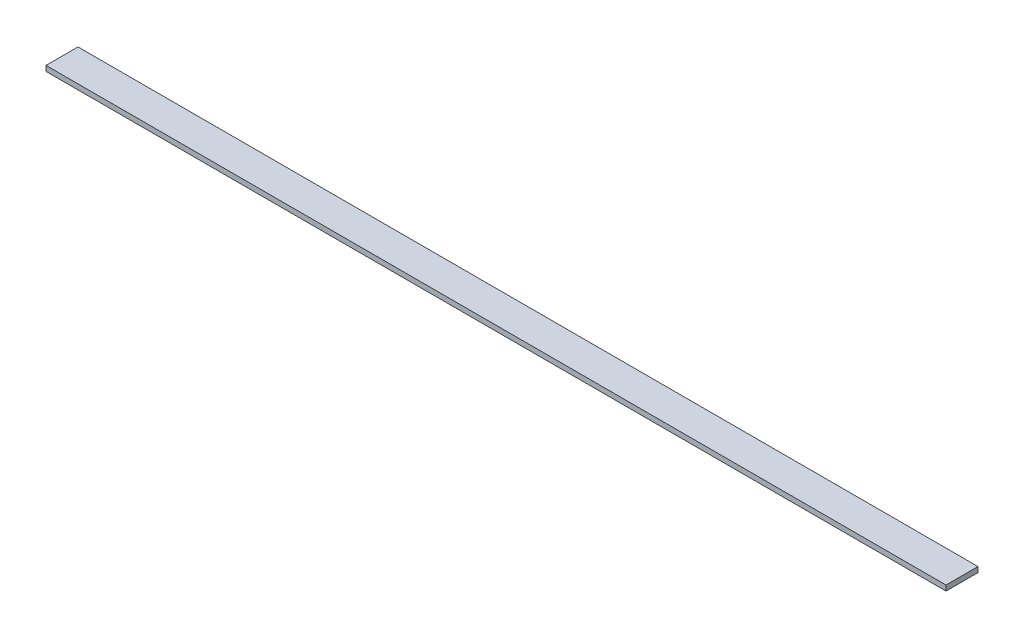
ISO-10303-21;
HEADER;
FILE_DESCRIPTION(('STEP AP214'),'2;1');
FILE_NAME('part.step','',(''),(''),'','','');
FILE_SCHEMA(('AUTOMOTIVE_DESIGN { 1 0 10303 214 1 1 1 1 }'));
ENDSEC;
DATA;
#1=APPLICATION_CONTEXT('core data for automotive mechanical design processes');
#2=APPLICATION_PROTOCOL_DEFINITION('international standard','automotive_design',2000,#1);
#3=PRODUCT_CONTEXT('',#1,'mechanical');
#4=PRODUCT('Part','Part','',(#3));
#5=PRODUCT_RELATED_PRODUCT_CATEGORY('part','',(#4));
#6=PRODUCT_DEFINITION_FORMATION('','',#4);
#7=PRODUCT_DEFINITION_CONTEXT('part definition',#1,'design');
#8=PRODUCT_DEFINITION('design','',#6,#7);
#9=PRODUCT_DEFINITION_SHAPE('','',#8);
#10=(LENGTH_UNIT() NAMED_UNIT(*) SI_UNIT(.MILLI.,.METRE.));
#11=(NAMED_UNIT(*) PLANE_ANGLE_UNIT() SI_UNIT($,.RADIAN.));
#12=(NAMED_UNIT(*) SI_UNIT($,.STERADIAN.) SOLID_ANGLE_UNIT());
#13=UNCERTAINTY_MEASURE_WITH_UNIT(LENGTH_MEASURE(1.E-05),#10,'distance_accuracy_value','');
#14=(GEOMETRIC_REPRESENTATION_CONTEXT(3) GLOBAL_UNCERTAINTY_ASSIGNED_CONTEXT((#13)) GLOBAL_UNIT_ASSIGNED_CONTEXT((#10,
#11,#12)) REPRESENTATION_CONTEXT('',''));
#15=CARTESIAN_POINT('',(0.,0.,0.));
#16=DIRECTION('',(0.,0.,1.));
#17=DIRECTION('',(1.,0.,0.));
#18=AXIS2_PLACEMENT_3D('',#15,#16,#17);
#19=CARTESIAN_POINT('',(0.,5.1054,0.));
#20=DIRECTION('',(0.,0.,1.));
#21=DIRECTION('',(1.,0.,0.));
#22=AXIS2_PLACEMENT_3D('',#19,#20,#21);
#23=PLANE('',#22);
#24=DIRECTION('',(-1.,0.,0.));
#25=VECTOR('',#24,1.);
#26=CARTESIAN_POINT('',(0.,-5.1054,0.));
#27=LINE('',#26,#25);
#28=CARTESIAN_POINT('',(0.,-5.1054,0.));
#29=VERTEX_POINT('',#28);
#30=CARTESIAN_POINT('',(-1752.6,-5.1054,0.));
#31=VERTEX_POINT('',#30);
#32=EDGE_CURVE('E107',#29,#31,#27,.T.);
#33=ORIENTED_EDGE('',*,*,#32,.T.);
#34=DIRECTION('',(0.,-1.,0.));
#35=VECTOR('',#34,1.);
#36=CARTESIAN_POINT('',(-1752.6,5.1054,0.));
#37=LINE('',#36,#35);
#38=CARTESIAN_POINT('',(-1752.6,5.1054,0.));
#39=VERTEX_POINT('',#38);
#40=EDGE_CURVE('E11',#39,#31,#37,.T.);
#41=ORIENTED_EDGE('',*,*,#40,.F.);
#42=DIRECTION('',(-1.,0.,0.));
#43=VECTOR('',#42,1.);
#44=CARTESIAN_POINT('',(0.,5.1054,0.));
#45=LINE('',#44,#43);
#46=CARTESIAN_POINT('',(0.,5.1054,0.));
#47=VERTEX_POINT('',#46);
#48=EDGE_CURVE('E88',#47,#39,#45,.T.);
#49=ORIENTED_EDGE('',*,*,#48,.F.);
#50=DIRECTION('',(0.,-1.,0.));
#51=VECTOR('',#50,1.);
#52=CARTESIAN_POINT('',(0.,5.1054,0.));
#53=LINE('',#52,#51);
#54=EDGE_CURVE('E103',#47,#29,#53,.T.);
#55=ORIENTED_EDGE('',*,*,#54,.T.);
#56=EDGE_LOOP('',(#33,#41,#49,#55));
#57=FACE_BOUND('',#56,.T.);
#58=ADVANCED_FACE('F36',(#57),#23,.F.);
#59=CARTESIAN_POINT('',(-1752.6,5.1054,0.));
#60=DIRECTION('',(1.,0.,0.));
#61=DIRECTION('',(0.,0.,-1.));
#62=AXIS2_PLACEMENT_3D('',#59,#60,#61);
#63=PLANE('',#62);
#64=DIRECTION('',(0.,0.,1.));
#65=VECTOR('',#64,1.);
#66=CARTESIAN_POINT('',(-1752.6,-5.1054,0.));
#67=LINE('',#66,#65);
#68=CARTESIAN_POINT('',(-1752.6,-5.1054,62.2808000000002));
#69=VERTEX_POINT('',#68);
#70=EDGE_CURVE('E93',#31,#69,#67,.T.);
#71=ORIENTED_EDGE('',*,*,#70,.T.);
#72=DIRECTION('',(0.,-1.,0.));
#73=VECTOR('',#72,1.);
#74=CARTESIAN_POINT('',(-1752.6,5.1054,62.2808000000002));
#75=LINE('',#74,#73);
#76=CARTESIAN_POINT('',(-1752.6,5.1054,62.2808000000002));
#77=VERTEX_POINT('',#76);
#78=EDGE_CURVE('E45',#77,#69,#75,.T.);
#79=ORIENTED_EDGE('',*,*,#78,.F.);
#80=DIRECTION('',(0.,0.,1.));
#81=VECTOR('',#80,1.);
#82=CARTESIAN_POINT('',(-1752.6,5.1054,0.));
#83=LINE('',#82,#81);
#84=EDGE_CURVE('E83',#39,#77,#83,.T.);
#85=ORIENTED_EDGE('',*,*,#84,.F.);
#86=ORIENTED_EDGE('',*,*,#40,.T.);
#87=EDGE_LOOP('',(#71,#79,#85,#86));
#88=FACE_BOUND('',#87,.T.);
#89=ADVANCED_FACE('F92',(#88),#63,.F.);
#90=CARTESIAN_POINT('',(-1752.6,5.1054,62.2808000000002));
#91=DIRECTION('',(0.,0.,-1.));
#92=DIRECTION('',(-1.,0.,0.));
#93=AXIS2_PLACEMENT_3D('',#90,#91,#92);
#94=PLANE('',#93);
#95=DIRECTION('',(1.,0.,0.));
#96=VECTOR('',#95,1.);
#97=CARTESIAN_POINT('',(-1752.6,-5.1054,62.2808000000002));
#98=LINE('',#97,#96);
#99=CARTESIAN_POINT('',(0.,-5.1054,62.2808000000002));
#100=VERTEX_POINT('',#99);
#101=EDGE_CURVE('E70',#69,#100,#98,.T.);
#102=ORIENTED_EDGE('',*,*,#101,.T.);
#103=DIRECTION('',(0.,-1.,0.));
#104=VECTOR('',#103,1.);
#105=CARTESIAN_POINT('',(0.,5.1054,62.2808000000002));
#106=LINE('',#105,#104);
#107=CARTESIAN_POINT('',(0.,5.1054,62.2808000000002));
#108=VERTEX_POINT('',#107);
#109=EDGE_CURVE('E95',#108,#100,#106,.T.);
#110=ORIENTED_EDGE('',*,*,#109,.F.);
#111=DIRECTION('',(1.,0.,0.));
#112=VECTOR('',#111,1.);
#113=CARTESIAN_POINT('',(-1752.6,5.1054,62.2808000000002));
#114=LINE('',#113,#112);
#115=EDGE_CURVE('E86',#77,#108,#114,.T.);
#116=ORIENTED_EDGE('',*,*,#115,.F.);
#117=ORIENTED_EDGE('',*,*,#78,.T.);
#118=EDGE_LOOP('',(#102,#110,#116,#117));
#119=FACE_BOUND('',#118,.T.);
#120=ADVANCED_FACE('F96',(#119),#94,.F.);
#121=CARTESIAN_POINT('',(0.,5.1054,0.));
#122=DIRECTION('',(-1.,0.,0.));
#123=DIRECTION('',(0.,0.,1.));
#124=AXIS2_PLACEMENT_3D('',#121,#122,#123);
#125=PLANE('',#124);
#126=DIRECTION('',(0.,0.,-1.));
#127=VECTOR('',#126,1.);
#128=CARTESIAN_POINT('',(0.,-5.1054,0.));
#129=LINE('',#128,#127);
#130=EDGE_CURVE('E76',#100,#29,#129,.T.);
#131=ORIENTED_EDGE('',*,*,#130,.T.);
#132=ORIENTED_EDGE('',*,*,#54,.F.);
#133=DIRECTION('',(0.,0.,-1.));
#134=VECTOR('',#133,1.);
#135=CARTESIAN_POINT('',(0.,5.1054,0.));
#136=LINE('',#135,#134);
#137=EDGE_CURVE('E53',#108,#47,#136,.T.);
#138=ORIENTED_EDGE('',*,*,#137,.F.);
#139=ORIENTED_EDGE('',*,*,#109,.T.);
#140=EDGE_LOOP('',(#131,#132,#138,#139));
#141=FACE_BOUND('',#140,.T.);
#142=ADVANCED_FACE('F119',(#141),#125,.F.);
#143=CARTESIAN_POINT('',(0.,5.1054,0.));
#144=DIRECTION('',(0.,1.,0.));
#145=DIRECTION('',(0.,0.,1.));
#146=AXIS2_PLACEMENT_3D('',#143,#144,#145);
#147=PLANE('',#146);
#148=ORIENTED_EDGE('',*,*,#48,.T.);
#149=ORIENTED_EDGE('',*,*,#84,.T.);
#150=ORIENTED_EDGE('',*,*,#115,.T.);
#151=ORIENTED_EDGE('',*,*,#137,.T.);
#152=EDGE_LOOP('',(#148,#149,#150,#151));
#153=FACE_BOUND('',#152,.T.);
#154=ADVANCED_FACE('F84',(#153),#147,.T.);
#155=CARTESIAN_POINT('',(0.,-5.1054,0.));
#156=DIRECTION('',(0.,1.,0.));
#157=DIRECTION('',(0.,0.,1.));
#158=AXIS2_PLACEMENT_3D('',#155,#156,#157);
#159=PLANE('',#158);
#160=ORIENTED_EDGE('',*,*,#32,.F.);
#161=ORIENTED_EDGE('',*,*,#130,.F.);
#162=ORIENTED_EDGE('',*,*,#101,.F.);
#163=ORIENTED_EDGE('',*,*,#70,.F.);
#164=EDGE_LOOP('',(#160,#161,#162,#163));
#165=FACE_BOUND('',#164,.T.);
#166=ADVANCED_FACE('F122',(#165),#159,.F.);
#167=CLOSED_SHELL('',(#58,#89,#120,#142,#154,#166));
#168=MANIFOLD_SOLID_BREP('B2',#167);
#169=ADVANCED_BREP_SHAPE_REPRESENTATION('',(#18,#168),#14);
#170=SHAPE_DEFINITION_REPRESENTATION(#9,#169);
ENDSEC;
END-ISO-10303-21;
